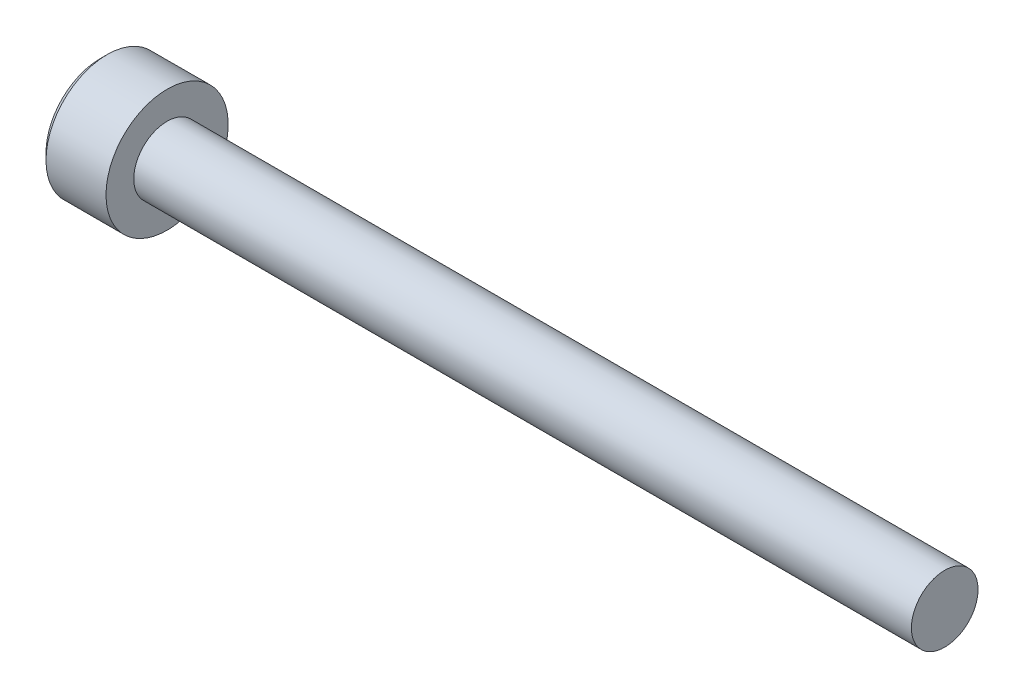
ISO-10303-21;
HEADER;
FILE_DESCRIPTION(('STEP AP214'),'2;1');
FILE_NAME('part.step','',(''),(''),'','','');
FILE_SCHEMA(('AUTOMOTIVE_DESIGN { 1 0 10303 214 1 1 1 1 }'));
ENDSEC;
DATA;
#1=APPLICATION_CONTEXT('core data for automotive mechanical design processes');
#2=APPLICATION_PROTOCOL_DEFINITION('international standard','automotive_design',2000,#1);
#3=PRODUCT_CONTEXT('',#1,'mechanical');
#4=PRODUCT('Part','Part','',(#3));
#5=PRODUCT_RELATED_PRODUCT_CATEGORY('part','',(#4));
#6=PRODUCT_DEFINITION_FORMATION('','',#4);
#7=PRODUCT_DEFINITION_CONTEXT('part definition',#1,'design');
#8=PRODUCT_DEFINITION('design','',#6,#7);
#9=PRODUCT_DEFINITION_SHAPE('','',#8);
#10=(LENGTH_UNIT() NAMED_UNIT(*) SI_UNIT(.MILLI.,.METRE.));
#11=(NAMED_UNIT(*) PLANE_ANGLE_UNIT() SI_UNIT($,.RADIAN.));
#12=(NAMED_UNIT(*) SI_UNIT($,.STERADIAN.) SOLID_ANGLE_UNIT());
#13=UNCERTAINTY_MEASURE_WITH_UNIT(LENGTH_MEASURE(1.E-05),#10,'distance_accuracy_value','');
#14=(GEOMETRIC_REPRESENTATION_CONTEXT(3) GLOBAL_UNCERTAINTY_ASSIGNED_CONTEXT((#13)) GLOBAL_UNIT_ASSIGNED_CONTEXT((#10,
#11,#12)) REPRESENTATION_CONTEXT('',''));
#15=CARTESIAN_POINT('',(0.,0.,0.));
#16=DIRECTION('',(0.,0.,1.));
#17=DIRECTION('',(1.,0.,0.));
#18=AXIS2_PLACEMENT_3D('',#15,#16,#17);
#19=CARTESIAN_POINT('',(-1.7,0.,0.));
#20=DIRECTION('',(-1.,0.,0.));
#21=DIRECTION('',(0.,0.,1.));
#22=AXIS2_PLACEMENT_3D('',#19,#20,#21);
#23=PLANE('',#22);
#24=DIRECTION('',(0.,0.5,-0.866025403784439));
#25=VECTOR('',#24,1.);
#26=CARTESIAN_POINT('',(-1.7,0.721687836487033,1.25));
#27=LINE('',#26,#25);
#28=CARTESIAN_POINT('',(-1.7,0.721687836487033,1.25));
#29=VERTEX_POINT('',#28);
#30=CARTESIAN_POINT('',(-1.7,1.08253175473055,0.624999999999999));
#31=VERTEX_POINT('',#30);
#32=EDGE_CURVE('E168',#29,#31,#27,.T.);
#33=ORIENTED_EDGE('',*,*,#32,.T.);
#34=CARTESIAN_POINT('',(-1.7,0.,0.));
#35=DIRECTION('',(1.,0.,0.));
#36=DIRECTION('',(0.,1.,0.));
#37=AXIS2_PLACEMENT_3D('',#34,#35,#36);
#38=CIRCLE('',#37,1.25);
#39=CARTESIAN_POINT('',(-1.7,0.,1.25));
#40=VERTEX_POINT('',#39);
#41=EDGE_CURVE('E60',#31,#40,#38,.T.);
#42=ORIENTED_EDGE('',*,*,#41,.T.);
#43=DIRECTION('',(0.,1.,0.));
#44=VECTOR('',#43,1.);
#45=CARTESIAN_POINT('',(-1.7,-0.721687836487032,1.25));
#46=LINE('',#45,#44);
#47=EDGE_CURVE('E181',#40,#29,#46,.T.);
#48=ORIENTED_EDGE('',*,*,#47,.T.);
#49=EDGE_LOOP('',(#33,#42,#48));
#50=FACE_BOUND('',#49,.T.);
#51=ADVANCED_FACE('F45',(#50),#23,.T.);
#52=CARTESIAN_POINT('',(-1.7,-0.721687836487032,1.25));
#53=VERTEX_POINT('',#52);
#54=EDGE_CURVE('E182',#53,#40,#46,.T.);
#55=ORIENTED_EDGE('',*,*,#54,.T.);
#56=CARTESIAN_POINT('',(-1.7,-1.08253175473055,0.625));
#57=VERTEX_POINT('',#56);
#58=EDGE_CURVE('E222',#40,#57,#38,.T.);
#59=ORIENTED_EDGE('',*,*,#58,.T.);
#60=DIRECTION('',(0.,0.5,0.866025403784439));
#61=VECTOR('',#60,1.);
#62=CARTESIAN_POINT('',(-1.7,-1.44337567297406,0.));
#63=LINE('',#62,#61);
#64=EDGE_CURVE('E177',#57,#53,#63,.T.);
#65=ORIENTED_EDGE('',*,*,#64,.T.);
#66=EDGE_LOOP('',(#55,#59,#65));
#67=FACE_BOUND('',#66,.T.);
#68=ADVANCED_FACE('F133',(#67),#23,.T.);
#69=CARTESIAN_POINT('',(-1.7,-1.44337567297406,0.));
#70=VERTEX_POINT('',#69);
#71=EDGE_CURVE('E178',#70,#57,#63,.T.);
#72=ORIENTED_EDGE('',*,*,#71,.T.);
#73=CARTESIAN_POINT('',(-1.7,-1.08253175473055,-0.625));
#74=VERTEX_POINT('',#73);
#75=EDGE_CURVE('E225',#57,#74,#38,.T.);
#76=ORIENTED_EDGE('',*,*,#75,.T.);
#77=DIRECTION('',(0.,-0.5,0.866025403784439));
#78=VECTOR('',#77,1.);
#79=CARTESIAN_POINT('',(-1.7,-0.721687836487031,-1.25));
#80=LINE('',#79,#78);
#81=EDGE_CURVE('E173',#74,#70,#80,.T.);
#82=ORIENTED_EDGE('',*,*,#81,.T.);
#83=EDGE_LOOP('',(#72,#76,#82));
#84=FACE_BOUND('',#83,.T.);
#85=ADVANCED_FACE('F140',(#84),#23,.T.);
#86=CARTESIAN_POINT('',(-1.7,-0.721687836487031,-1.25));
#87=VERTEX_POINT('',#86);
#88=EDGE_CURVE('E174',#87,#74,#80,.T.);
#89=ORIENTED_EDGE('',*,*,#88,.T.);
#90=CARTESIAN_POINT('',(-1.7,0.,-1.25));
#91=VERTEX_POINT('',#90);
#92=EDGE_CURVE('E228',#74,#91,#38,.T.);
#93=ORIENTED_EDGE('',*,*,#92,.T.);
#94=DIRECTION('',(0.,-1.,0.));
#95=VECTOR('',#94,1.);
#96=CARTESIAN_POINT('',(-1.7,0.721687836487034,-1.25));
#97=LINE('',#96,#95);
#98=EDGE_CURVE('E163',#91,#87,#97,.T.);
#99=ORIENTED_EDGE('',*,*,#98,.T.);
#100=EDGE_LOOP('',(#89,#93,#99));
#101=FACE_BOUND('',#100,.T.);
#102=ADVANCED_FACE('F154',(#101),#23,.T.);
#103=CARTESIAN_POINT('',(-1.7,0.721687836487034,-1.25));
#104=VERTEX_POINT('',#103);
#105=EDGE_CURVE('E166',#104,#91,#97,.T.);
#106=ORIENTED_EDGE('',*,*,#105,.T.);
#107=CARTESIAN_POINT('',(-1.7,1.08253175473055,-0.624999999999999));
#108=VERTEX_POINT('',#107);
#109=EDGE_CURVE('E230',#91,#108,#38,.T.);
#110=ORIENTED_EDGE('',*,*,#109,.T.);
#111=DIRECTION('',(0.,-0.499999999999999,-0.866025403784439));
#112=VECTOR('',#111,1.);
#113=CARTESIAN_POINT('',(-1.7,1.44337567297406,0.));
#114=LINE('',#113,#112);
#115=EDGE_CURVE('E164',#108,#104,#114,.T.);
#116=ORIENTED_EDGE('',*,*,#115,.T.);
#117=EDGE_LOOP('',(#106,#110,#116));
#118=FACE_BOUND('',#117,.T.);
#119=ADVANCED_FACE('F146',(#118),#23,.T.);
#120=CARTESIAN_POINT('',(-1.7,1.44337567297406,0.));
#121=VERTEX_POINT('',#120);
#122=EDGE_CURVE('E158',#121,#108,#114,.T.);
#123=ORIENTED_EDGE('',*,*,#122,.T.);
#124=EDGE_CURVE('E159',#108,#31,#38,.T.);
#125=ORIENTED_EDGE('',*,*,#124,.T.);
#126=EDGE_CURVE('E161',#31,#121,#27,.T.);
#127=ORIENTED_EDGE('',*,*,#126,.T.);
#128=EDGE_LOOP('',(#123,#125,#127));
#129=FACE_BOUND('',#128,.T.);
#130=ADVANCED_FACE('F135',(#129),#23,.T.);
#131=CARTESIAN_POINT('',(-3.,0.,0.));
#132=DIRECTION('',(1.,0.,0.));
#133=DIRECTION('',(0.,0.,-1.));
#134=AXIS2_PLACEMENT_3D('',#131,#132,#133);
#135=PLANE('',#134);
#136=CARTESIAN_POINT('',(-3.,0.,0.));
#137=DIRECTION('',(1.,0.,0.));
#138=DIRECTION('',(0.,0.,-1.));
#139=AXIS2_PLACEMENT_3D('',#136,#137,#138);
#140=CIRCLE('',#139,2.45);
#141=CARTESIAN_POINT('',(-3.,0.,-2.45));
#142=VERTEX_POINT('',#141);
#143=EDGE_CURVE('E53',#142,#142,#140,.F.);
#144=ORIENTED_EDGE('',*,*,#143,.T.);
#145=EDGE_LOOP('',(#144));
#146=FACE_BOUND('',#145,.T.);
#147=DIRECTION('',(0.,-0.499999999999999,-0.866025403784439));
#148=VECTOR('',#147,1.);
#149=CARTESIAN_POINT('',(-3.,1.44337567297406,0.));
#150=LINE('',#149,#148);
#151=CARTESIAN_POINT('',(-3.,1.44337567297406,0.));
#152=VERTEX_POINT('',#151);
#153=CARTESIAN_POINT('',(-3.,0.721687836487034,-1.25));
#154=VERTEX_POINT('',#153);
#155=EDGE_CURVE('E187',#152,#154,#150,.T.);
#156=ORIENTED_EDGE('',*,*,#155,.F.);
#157=DIRECTION('',(0.,0.5,-0.866025403784439));
#158=VECTOR('',#157,1.);
#159=CARTESIAN_POINT('',(-3.,0.721687836487033,1.25));
#160=LINE('',#159,#158);
#161=CARTESIAN_POINT('',(-3.,0.721687836487033,1.25));
#162=VERTEX_POINT('',#161);
#163=EDGE_CURVE('E68',#162,#152,#160,.T.);
#164=ORIENTED_EDGE('',*,*,#163,.F.);
#165=DIRECTION('',(0.,1.,0.));
#166=VECTOR('',#165,1.);
#167=CARTESIAN_POINT('',(-3.,-0.721687836487032,1.25));
#168=LINE('',#167,#166);
#169=CARTESIAN_POINT('',(-3.,-0.721687836487032,1.25));
#170=VERTEX_POINT('',#169);
#171=EDGE_CURVE('E199',#170,#162,#168,.T.);
#172=ORIENTED_EDGE('',*,*,#171,.F.);
#173=DIRECTION('',(0.,0.5,0.866025403784439));
#174=VECTOR('',#173,1.);
#175=CARTESIAN_POINT('',(-3.,-1.44337567297406,0.));
#176=LINE('',#175,#174);
#177=CARTESIAN_POINT('',(-3.,-1.44337567297406,0.));
#178=VERTEX_POINT('',#177);
#179=EDGE_CURVE('E196',#178,#170,#176,.T.);
#180=ORIENTED_EDGE('',*,*,#179,.F.);
#181=DIRECTION('',(0.,-0.5,0.866025403784439));
#182=VECTOR('',#181,1.);
#183=CARTESIAN_POINT('',(-3.,-0.721687836487031,-1.25));
#184=LINE('',#183,#182);
#185=CARTESIAN_POINT('',(-3.,-0.721687836487031,-1.25));
#186=VERTEX_POINT('',#185);
#187=EDGE_CURVE('E193',#186,#178,#184,.T.);
#188=ORIENTED_EDGE('',*,*,#187,.F.);
#189=DIRECTION('',(0.,-1.,0.));
#190=VECTOR('',#189,1.);
#191=CARTESIAN_POINT('',(-3.,0.721687836487034,-1.25));
#192=LINE('',#191,#190);
#193=EDGE_CURVE('E190',#154,#186,#192,.T.);
#194=ORIENTED_EDGE('',*,*,#193,.F.);
#195=EDGE_LOOP('',(#156,#164,#172,#180,#188,#194));
#196=FACE_BOUND('',#195,.T.);
#197=ADVANCED_FACE('F145',(#146,#196),#135,.F.);
#198=CARTESIAN_POINT('',(35.,1.5,0.));
#199=DIRECTION('',(-1.,0.,0.));
#200=DIRECTION('',(0.,0.,1.));
#201=AXIS2_PLACEMENT_3D('',#198,#199,#200);
#202=PLANE('',#201);
#203=CARTESIAN_POINT('',(35.,0.,0.));
#204=DIRECTION('',(-1.,0.,0.));
#205=DIRECTION('',(0.,0.,1.));
#206=AXIS2_PLACEMENT_3D('',#203,#204,#205);
#207=CIRCLE('',#206,1.5);
#208=CARTESIAN_POINT('',(35.,0.,1.5));
#209=VERTEX_POINT('',#208);
#210=EDGE_CURVE('E219',#209,#209,#207,.T.);
#211=ORIENTED_EDGE('',*,*,#210,.F.);
#212=EDGE_LOOP('',(#211));
#213=FACE_BOUND('',#212,.T.);
#214=ADVANCED_FACE('F152',(#213),#202,.F.);
#215=CARTESIAN_POINT('',(-3.,0.,0.));
#216=DIRECTION('',(-1.,0.,0.));
#217=DIRECTION('',(0.,0.,1.));
#218=AXIS2_PLACEMENT_3D('',#215,#216,#217);
#219=CYLINDRICAL_SURFACE('',#218,1.5);
#220=CARTESIAN_POINT('',(0.,0.,0.));
#221=DIRECTION('',(-1.,0.,0.));
#222=DIRECTION('',(0.,0.,1.));
#223=AXIS2_PLACEMENT_3D('',#220,#221,#222);
#224=CIRCLE('',#223,1.5);
#225=CARTESIAN_POINT('',(0.,0.,1.5));
#226=VERTEX_POINT('',#225);
#227=EDGE_CURVE('E216',#226,#226,#224,.T.);
#228=ORIENTED_EDGE('',*,*,#227,.F.);
#229=EDGE_LOOP('',(#228));
#230=FACE_BOUND('',#229,.T.);
#231=ORIENTED_EDGE('',*,*,#210,.T.);
#232=EDGE_LOOP('',(#231));
#233=FACE_BOUND('',#232,.T.);
#234=ADVANCED_FACE('F273',(#230,#233),#219,.T.);
#235=CARTESIAN_POINT('',(0.,1.5,0.));
#236=DIRECTION('',(-1.,0.,0.));
#237=DIRECTION('',(0.,0.,1.));
#238=AXIS2_PLACEMENT_3D('',#235,#236,#237);
#239=PLANE('',#238);
#240=CARTESIAN_POINT('',(0.,0.,0.));
#241=DIRECTION('',(-1.,0.,0.));
#242=DIRECTION('',(0.,0.,1.));
#243=AXIS2_PLACEMENT_3D('',#240,#241,#242);
#244=CIRCLE('',#243,2.75);
#245=CARTESIAN_POINT('',(0.,0.,2.75));
#246=VERTEX_POINT('',#245);
#247=EDGE_CURVE('E204',#246,#246,#244,.T.);
#248=ORIENTED_EDGE('',*,*,#247,.F.);
#249=EDGE_LOOP('',(#248));
#250=FACE_BOUND('',#249,.T.);
#251=ORIENTED_EDGE('',*,*,#227,.T.);
#252=EDGE_LOOP('',(#251));
#253=FACE_BOUND('',#252,.T.);
#254=ADVANCED_FACE('F267',(#250,#253),#239,.F.);
#255=CARTESIAN_POINT('',(-3.,0.,0.));
#256=DIRECTION('',(-1.,0.,0.));
#257=DIRECTION('',(0.,0.,1.));
#258=AXIS2_PLACEMENT_3D('',#255,#256,#257);
#259=CYLINDRICAL_SURFACE('',#258,2.75);
#260=CARTESIAN_POINT('',(-2.7,0.,0.));
#261=DIRECTION('',(1.,0.,0.));
#262=DIRECTION('',(0.,0.,-1.));
#263=AXIS2_PLACEMENT_3D('',#260,#261,#262);
#264=CIRCLE('',#263,2.75);
#265=CARTESIAN_POINT('',(-2.7,0.,-2.75));
#266=VERTEX_POINT('',#265);
#267=EDGE_CURVE('E11',#266,#266,#264,.T.);
#268=ORIENTED_EDGE('',*,*,#267,.T.);
#269=EDGE_LOOP('',(#268));
#270=FACE_BOUND('',#269,.T.);
#271=ORIENTED_EDGE('',*,*,#247,.T.);
#272=EDGE_LOOP('',(#271));
#273=FACE_BOUND('',#272,.T.);
#274=ADVANCED_FACE('F261',(#270,#273),#259,.T.);
#275=CARTESIAN_POINT('',(-1.7,0.721687836487033,1.25));
#276=DIRECTION('',(0.,0.866025403784439,0.5));
#277=DIRECTION('',(0.,-0.5,0.866025403784439));
#278=AXIS2_PLACEMENT_3D('',#275,#276,#277);
#279=PLANE('',#278);
#280=ORIENTED_EDGE('',*,*,#163,.T.);
#281=DIRECTION('',(-1.,0.,0.));
#282=VECTOR('',#281,1.);
#283=CARTESIAN_POINT('',(-1.7,1.44337567297406,0.));
#284=LINE('',#283,#282);
#285=EDGE_CURVE('E185',#121,#152,#284,.T.);
#286=ORIENTED_EDGE('',*,*,#285,.F.);
#287=ORIENTED_EDGE('',*,*,#126,.F.);
#288=ORIENTED_EDGE('',*,*,#32,.F.);
#289=DIRECTION('',(-1.,0.,0.));
#290=VECTOR('',#289,1.);
#291=CARTESIAN_POINT('',(-1.7,0.721687836487033,1.25));
#292=LINE('',#291,#290);
#293=EDGE_CURVE('E202',#29,#162,#292,.T.);
#294=ORIENTED_EDGE('',*,*,#293,.T.);
#295=EDGE_LOOP('',(#280,#286,#287,#288,#294));
#296=FACE_BOUND('',#295,.T.);
#297=ADVANCED_FACE('F260',(#296),#279,.F.);
#298=CARTESIAN_POINT('',(-1.7,-0.721687836487032,1.25));
#299=DIRECTION('',(0.,0.,1.));
#300=DIRECTION('',(0.,-1.,0.));
#301=AXIS2_PLACEMENT_3D('',#298,#299,#300);
#302=PLANE('',#301);
#303=ORIENTED_EDGE('',*,*,#171,.T.);
#304=ORIENTED_EDGE('',*,*,#293,.F.);
#305=ORIENTED_EDGE('',*,*,#47,.F.);
#306=ORIENTED_EDGE('',*,*,#54,.F.);
#307=DIRECTION('',(-1.,0.,0.));
#308=VECTOR('',#307,1.);
#309=CARTESIAN_POINT('',(-1.7,-0.721687836487032,1.25));
#310=LINE('',#309,#308);
#311=EDGE_CURVE('E205',#53,#170,#310,.T.);
#312=ORIENTED_EDGE('',*,*,#311,.T.);
#313=EDGE_LOOP('',(#303,#304,#305,#306,#312));
#314=FACE_BOUND('',#313,.T.);
#315=ADVANCED_FACE('F257',(#314),#302,.F.);
#316=CARTESIAN_POINT('',(-1.7,-1.44337567297406,0.));
#317=DIRECTION('',(0.,-0.866025403784439,0.5));
#318=DIRECTION('',(0.,-0.5,-0.866025403784439));
#319=AXIS2_PLACEMENT_3D('',#316,#317,#318);
#320=PLANE('',#319);
#321=ORIENTED_EDGE('',*,*,#179,.T.);
#322=ORIENTED_EDGE('',*,*,#311,.F.);
#323=ORIENTED_EDGE('',*,*,#64,.F.);
#324=ORIENTED_EDGE('',*,*,#71,.F.);
#325=DIRECTION('',(-1.,0.,0.));
#326=VECTOR('',#325,1.);
#327=CARTESIAN_POINT('',(-1.7,-1.44337567297406,0.));
#328=LINE('',#327,#326);
#329=EDGE_CURVE('E207',#70,#178,#328,.T.);
#330=ORIENTED_EDGE('',*,*,#329,.T.);
#331=EDGE_LOOP('',(#321,#322,#323,#324,#330));
#332=FACE_BOUND('',#331,.T.);
#333=ADVANCED_FACE('F253',(#332),#320,.F.);
#334=CARTESIAN_POINT('',(-1.7,-0.721687836487031,-1.25));
#335=DIRECTION('',(0.,-0.866025403784439,-0.5));
#336=DIRECTION('',(0.,0.5,-0.866025403784439));
#337=AXIS2_PLACEMENT_3D('',#334,#335,#336);
#338=PLANE('',#337);
#339=ORIENTED_EDGE('',*,*,#187,.T.);
#340=ORIENTED_EDGE('',*,*,#329,.F.);
#341=ORIENTED_EDGE('',*,*,#81,.F.);
#342=ORIENTED_EDGE('',*,*,#88,.F.);
#343=DIRECTION('',(-1.,0.,0.));
#344=VECTOR('',#343,1.);
#345=CARTESIAN_POINT('',(-1.7,-0.721687836487031,-1.25));
#346=LINE('',#345,#344);
#347=EDGE_CURVE('E209',#87,#186,#346,.T.);
#348=ORIENTED_EDGE('',*,*,#347,.T.);
#349=EDGE_LOOP('',(#339,#340,#341,#342,#348));
#350=FACE_BOUND('',#349,.T.);
#351=ADVANCED_FACE('F248',(#350),#338,.F.);
#352=CARTESIAN_POINT('',(-1.7,0.721687836487034,-1.25));
#353=DIRECTION('',(0.,0.,-1.));
#354=DIRECTION('',(-1.,0.,0.));
#355=AXIS2_PLACEMENT_3D('',#352,#353,#354);
#356=PLANE('',#355);
#357=ORIENTED_EDGE('',*,*,#193,.T.);
#358=ORIENTED_EDGE('',*,*,#347,.F.);
#359=ORIENTED_EDGE('',*,*,#98,.F.);
#360=ORIENTED_EDGE('',*,*,#105,.F.);
#361=DIRECTION('',(-1.,0.,0.));
#362=VECTOR('',#361,1.);
#363=CARTESIAN_POINT('',(-1.7,0.721687836487034,-1.25));
#364=LINE('',#363,#362);
#365=EDGE_CURVE('E211',#104,#154,#364,.T.);
#366=ORIENTED_EDGE('',*,*,#365,.T.);
#367=EDGE_LOOP('',(#357,#358,#359,#360,#366));
#368=FACE_BOUND('',#367,.T.);
#369=ADVANCED_FACE('F128',(#368),#356,.F.);
#370=CARTESIAN_POINT('',(-1.7,1.44337567297406,0.));
#371=DIRECTION('',(0.,0.866025403784439,-0.499999999999999));
#372=DIRECTION('',(0.,0.499999999999999,0.866025403784439));
#373=AXIS2_PLACEMENT_3D('',#370,#371,#372);
#374=PLANE('',#373);
#375=ORIENTED_EDGE('',*,*,#155,.T.);
#376=ORIENTED_EDGE('',*,*,#365,.F.);
#377=ORIENTED_EDGE('',*,*,#115,.F.);
#378=ORIENTED_EDGE('',*,*,#122,.F.);
#379=ORIENTED_EDGE('',*,*,#285,.T.);
#380=EDGE_LOOP('',(#375,#376,#377,#378,#379));
#381=FACE_BOUND('',#380,.T.);
#382=ADVANCED_FACE('F120',(#381),#374,.F.);
#383=CARTESIAN_POINT('',(-0.97831216351296,0.,0.));
#384=DIRECTION('',(-1.,0.,0.));
#385=DIRECTION('',(0.,-1.,0.));
#386=AXIS2_PLACEMENT_3D('',#383,#384,#385);
#387=CONICAL_SURFACE('',#386,0.,1.04719755119659);
#388=ORIENTED_EDGE('',*,*,#41,.F.);
#389=ORIENTED_EDGE('',*,*,#124,.F.);
#390=ORIENTED_EDGE('',*,*,#109,.F.);
#391=ORIENTED_EDGE('',*,*,#92,.F.);
#392=ORIENTED_EDGE('',*,*,#75,.F.);
#393=ORIENTED_EDGE('',*,*,#58,.F.);
#394=EDGE_LOOP('',(#388,#389,#390,#391,#392,#393));
#395=FACE_BOUND('',#394,.T.);
#396=CARTESIAN_POINT('',(-0.97831216351296,0.,0.));
#397=VERTEX_POINT('',#396);
#398=VERTEX_LOOP('',#397);
#399=FACE_BOUND('',#398,.T.);
#400=ADVANCED_FACE('F118',(#395,#399),#387,.F.);
#401=CARTESIAN_POINT('',(-3.,0.,0.));
#402=DIRECTION('',(1.,0.,0.));
#403=DIRECTION('',(0.,0.,-1.));
#404=AXIS2_PLACEMENT_3D('',#401,#402,#403);
#405=CONICAL_SURFACE('',#404,2.45,0.785398163397444);
#406=ORIENTED_EDGE('',*,*,#267,.F.);
#407=EDGE_LOOP('',(#406));
#408=FACE_BOUND('',#407,.T.);
#409=ORIENTED_EDGE('',*,*,#143,.F.);
#410=EDGE_LOOP('',(#409));
#411=FACE_BOUND('',#410,.T.);
#412=ADVANCED_FACE('F47',(#408,#411),#405,.T.);
#413=CLOSED_SHELL('',(#51,#68,#85,#102,#119,#130,#197,#214,#234,#254,#274,#297,#315,#333,#351,
#369,#382,#400,#412));
#414=MANIFOLD_SOLID_BREP('B2',#413);
#415=ADVANCED_BREP_SHAPE_REPRESENTATION('',(#18,#414),#14);
#416=SHAPE_DEFINITION_REPRESENTATION(#9,#415);
ENDSEC;
END-ISO-10303-21;
